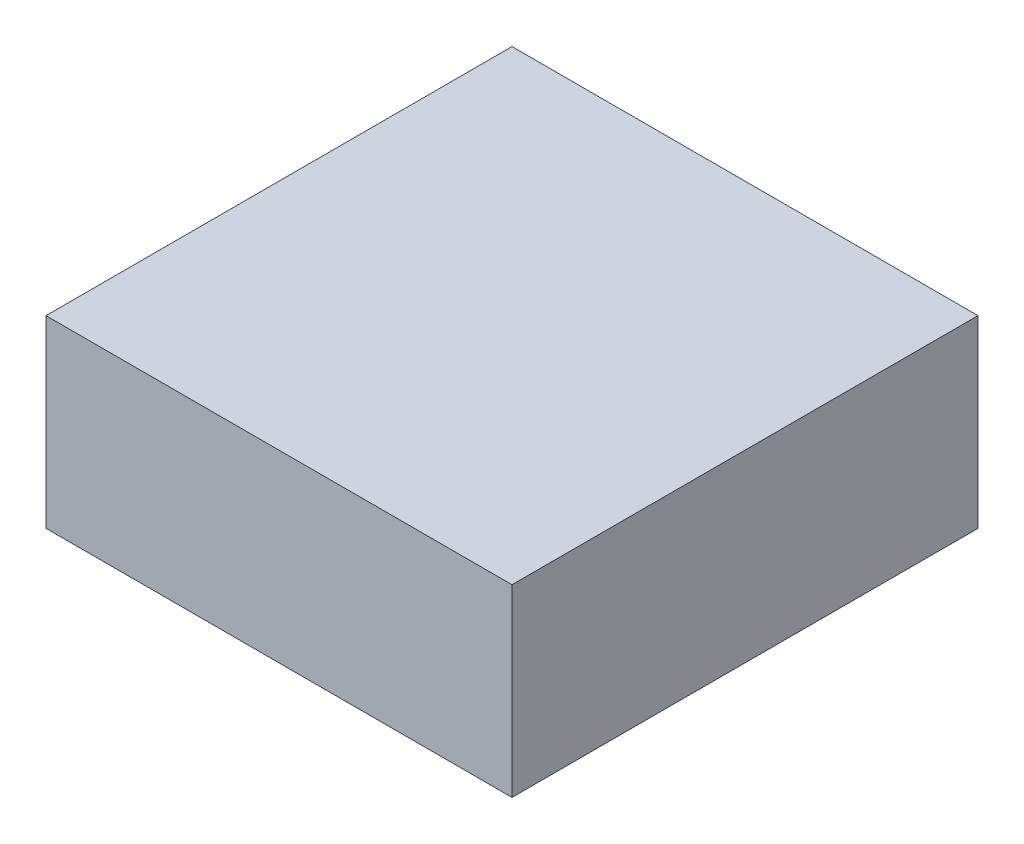
ISO-10303-21;
HEADER;
FILE_DESCRIPTION(('STEP AP214'),'2;1');
FILE_NAME('part.step','',(''),(''),'','','');
FILE_SCHEMA(('AUTOMOTIVE_DESIGN { 1 0 10303 214 1 1 1 1 }'));
ENDSEC;
DATA;
#1=APPLICATION_CONTEXT('core data for automotive mechanical design processes');
#2=APPLICATION_PROTOCOL_DEFINITION('international standard','automotive_design',2000,#1);
#3=PRODUCT_CONTEXT('',#1,'mechanical');
#4=PRODUCT('Part','Part','',(#3));
#5=PRODUCT_RELATED_PRODUCT_CATEGORY('part','',(#4));
#6=PRODUCT_DEFINITION_FORMATION('','',#4);
#7=PRODUCT_DEFINITION_CONTEXT('part definition',#1,'design');
#8=PRODUCT_DEFINITION('design','',#6,#7);
#9=PRODUCT_DEFINITION_SHAPE('','',#8);
#10=(LENGTH_UNIT() NAMED_UNIT(*) SI_UNIT(.MILLI.,.METRE.));
#11=(NAMED_UNIT(*) PLANE_ANGLE_UNIT() SI_UNIT($,.RADIAN.));
#12=(NAMED_UNIT(*) SI_UNIT($,.STERADIAN.) SOLID_ANGLE_UNIT());
#13=UNCERTAINTY_MEASURE_WITH_UNIT(LENGTH_MEASURE(1.E-05),#10,'distance_accuracy_value','');
#14=(GEOMETRIC_REPRESENTATION_CONTEXT(3) GLOBAL_UNCERTAINTY_ASSIGNED_CONTEXT((#13)) GLOBAL_UNIT_ASSIGNED_CONTEXT((#10,
#11,#12)) REPRESENTATION_CONTEXT('',''));
#15=CARTESIAN_POINT('',(0.,0.,0.));
#16=DIRECTION('',(0.,0.,1.));
#17=DIRECTION('',(1.,0.,0.));
#18=AXIS2_PLACEMENT_3D('',#15,#16,#17);
#19=CARTESIAN_POINT('',(0.,0.,0.));
#20=DIRECTION('',(0.,1.,0.));
#21=DIRECTION('',(0.,0.,1.));
#22=AXIS2_PLACEMENT_3D('',#19,#20,#21);
#23=PLANE('',#22);
#24=DIRECTION('',(0.,0.,1.));
#25=VECTOR('',#24,1.);
#26=CARTESIAN_POINT('',(29.4333501914267,0.,-37.9136664234594));
#27=LINE('',#26,#25);
#28=CARTESIAN_POINT('',(29.4333501914267,0.,-37.9136664234594));
#29=VERTEX_POINT('',#28);
#30=CARTESIAN_POINT('',(29.4333501914267,0.,-5.026060240705));
#31=VERTEX_POINT('',#30);
#32=EDGE_CURVE('E295',#29,#31,#27,.T.);
#33=ORIENTED_EDGE('',*,*,#32,.F.);
#34=DIRECTION('',(-1.,0.,0.));
#35=VECTOR('',#34,1.);
#36=CARTESIAN_POINT('',(29.4333501914267,0.,-37.9136664234594));
#37=LINE('',#36,#35);
#38=CARTESIAN_POINT('',(62.3209563741811,0.,-37.9136664234594));
#39=VERTEX_POINT('',#38);
#40=EDGE_CURVE('E95',#39,#29,#37,.T.);
#41=ORIENTED_EDGE('',*,*,#40,.F.);
#42=DIRECTION('',(0.,0.,-1.));
#43=VECTOR('',#42,1.);
#44=CARTESIAN_POINT('',(62.3209563741811,0.,-37.9136664234594));
#45=LINE('',#44,#43);
#46=CARTESIAN_POINT('',(62.3209563741811,0.,-5.026060240705));
#47=VERTEX_POINT('',#46);
#48=EDGE_CURVE('E309',#47,#39,#45,.T.);
#49=ORIENTED_EDGE('',*,*,#48,.F.);
#50=DIRECTION('',(1.,0.,0.));
#51=VECTOR('',#50,1.);
#52=CARTESIAN_POINT('',(29.4333501914267,0.,-5.026060240705));
#53=LINE('',#52,#51);
#54=EDGE_CURVE('E307',#31,#47,#53,.T.);
#55=ORIENTED_EDGE('',*,*,#54,.F.);
#56=EDGE_LOOP('',(#33,#41,#49,#55));
#57=FACE_BOUND('',#56,.T.);
#58=DIRECTION('',(0.,0.,1.));
#59=VECTOR('',#58,1.);
#60=CARTESIAN_POINT('',(31.4504743681425,0.,0.));
#61=LINE('',#60,#59);
#62=CARTESIAN_POINT('',(31.4504743681425,0.,-7.04318441742078));
#63=VERTEX_POINT('',#62);
#64=CARTESIAN_POINT('',(31.4504743681424,0.,-35.8965422467436));
#65=VERTEX_POINT('',#64);
#66=EDGE_CURVE('E12',#63,#65,#61,.F.);
#67=ORIENTED_EDGE('',*,*,#66,.F.);
#68=DIRECTION('',(1.,0.,0.));
#69=VECTOR('',#68,1.);
#70=CARTESIAN_POINT('',(0.,0.,-7.04318441742078));
#71=LINE('',#70,#69);
#72=CARTESIAN_POINT('',(60.3038321974653,0.,-7.04318441742079));
#73=VERTEX_POINT('',#72);
#74=EDGE_CURVE('E330',#73,#63,#71,.F.);
#75=ORIENTED_EDGE('',*,*,#74,.F.);
#76=DIRECTION('',(0.,0.,-1.));
#77=VECTOR('',#76,1.);
#78=CARTESIAN_POINT('',(60.3038321974653,0.,0.));
#79=LINE('',#78,#77);
#80=CARTESIAN_POINT('',(60.3038321974653,0.,-35.8965422467436));
#81=VERTEX_POINT('',#80);
#82=EDGE_CURVE('E329',#81,#73,#79,.F.);
#83=ORIENTED_EDGE('',*,*,#82,.F.);
#84=DIRECTION('',(-1.,0.,0.));
#85=VECTOR('',#84,1.);
#86=CARTESIAN_POINT('',(0.,0.,-35.8965422467436));
#87=LINE('',#86,#85);
#88=EDGE_CURVE('E54',#65,#81,#87,.F.);
#89=ORIENTED_EDGE('',*,*,#88,.F.);
#90=EDGE_LOOP('',(#67,#75,#83,#89));
#91=FACE_BOUND('',#90,.T.);
#92=ADVANCED_FACE('F46',(#57,#91),#23,.F.);
#93=CARTESIAN_POINT('',(29.4333501914267,13.,-37.9136664234594));
#94=DIRECTION('',(1.,0.,0.));
#95=DIRECTION('',(0.,0.,-1.));
#96=AXIS2_PLACEMENT_3D('',#93,#94,#95);
#97=PLANE('',#96);
#98=ORIENTED_EDGE('',*,*,#32,.T.);
#99=DIRECTION('',(0.,-1.,0.));
#100=VECTOR('',#99,1.);
#101=CARTESIAN_POINT('',(29.4333501914267,13.,-5.026060240705));
#102=LINE('',#101,#100);
#103=CARTESIAN_POINT('',(29.4333501914267,13.,-5.026060240705));
#104=VERTEX_POINT('',#103);
#105=EDGE_CURVE('E322',#104,#31,#102,.T.);
#106=ORIENTED_EDGE('',*,*,#105,.F.);
#107=DIRECTION('',(0.,0.,1.));
#108=VECTOR('',#107,1.);
#109=CARTESIAN_POINT('',(29.4333501914267,13.,-37.9136664234594));
#110=LINE('',#109,#108);
#111=CARTESIAN_POINT('',(29.4333501914267,13.,-37.9136664234594));
#112=VERTEX_POINT('',#111);
#113=EDGE_CURVE('E291',#112,#104,#110,.T.);
#114=ORIENTED_EDGE('',*,*,#113,.F.);
#115=DIRECTION('',(0.,-1.,0.));
#116=VECTOR('',#115,1.);
#117=CARTESIAN_POINT('',(29.4333501914267,13.,-37.9136664234594));
#118=LINE('',#117,#116);
#119=EDGE_CURVE('E303',#112,#29,#118,.T.);
#120=ORIENTED_EDGE('',*,*,#119,.T.);
#121=EDGE_LOOP('',(#98,#106,#114,#120));
#122=FACE_BOUND('',#121,.T.);
#123=ADVANCED_FACE('F48',(#122),#97,.F.);
#124=CARTESIAN_POINT('',(29.4333501914267,13.,-5.026060240705));
#125=DIRECTION('',(0.,0.,-1.));
#126=DIRECTION('',(-1.,0.,0.));
#127=AXIS2_PLACEMENT_3D('',#124,#125,#126);
#128=PLANE('',#127);
#129=ORIENTED_EDGE('',*,*,#54,.T.);
#130=DIRECTION('',(0.,-1.,0.));
#131=VECTOR('',#130,1.);
#132=CARTESIAN_POINT('',(62.3209563741811,13.,-5.026060240705));
#133=LINE('',#132,#131);
#134=CARTESIAN_POINT('',(62.3209563741811,13.,-5.026060240705));
#135=VERTEX_POINT('',#134);
#136=EDGE_CURVE('E319',#135,#47,#133,.T.);
#137=ORIENTED_EDGE('',*,*,#136,.F.);
#138=DIRECTION('',(1.,0.,0.));
#139=VECTOR('',#138,1.);
#140=CARTESIAN_POINT('',(29.4333501914267,13.,-5.026060240705));
#141=LINE('',#140,#139);
#142=EDGE_CURVE('E99',#104,#135,#141,.T.);
#143=ORIENTED_EDGE('',*,*,#142,.F.);
#144=ORIENTED_EDGE('',*,*,#105,.T.);
#145=EDGE_LOOP('',(#129,#137,#143,#144));
#146=FACE_BOUND('',#145,.T.);
#147=ADVANCED_FACE('F392',(#146),#128,.F.);
#148=CARTESIAN_POINT('',(62.3209563741811,13.,-37.9136664234594));
#149=DIRECTION('',(-1.,0.,0.));
#150=DIRECTION('',(0.,0.,1.));
#151=AXIS2_PLACEMENT_3D('',#148,#149,#150);
#152=PLANE('',#151);
#153=ORIENTED_EDGE('',*,*,#48,.T.);
#154=DIRECTION('',(0.,-1.,0.));
#155=VECTOR('',#154,1.);
#156=CARTESIAN_POINT('',(62.3209563741811,13.,-37.9136664234594));
#157=LINE('',#156,#155);
#158=CARTESIAN_POINT('',(62.3209563741811,13.,-37.9136664234594));
#159=VERTEX_POINT('',#158);
#160=EDGE_CURVE('E320',#159,#39,#157,.T.);
#161=ORIENTED_EDGE('',*,*,#160,.F.);
#162=DIRECTION('',(0.,0.,-1.));
#163=VECTOR('',#162,1.);
#164=CARTESIAN_POINT('',(62.3209563741811,13.,-37.9136664234594));
#165=LINE('',#164,#163);
#166=EDGE_CURVE('E297',#135,#159,#165,.T.);
#167=ORIENTED_EDGE('',*,*,#166,.F.);
#168=ORIENTED_EDGE('',*,*,#136,.T.);
#169=EDGE_LOOP('',(#153,#161,#167,#168));
#170=FACE_BOUND('',#169,.T.);
#171=ADVANCED_FACE('F401',(#170),#152,.F.);
#172=CARTESIAN_POINT('',(29.4333501914267,13.,-37.9136664234594));
#173=DIRECTION('',(0.,0.,1.));
#174=DIRECTION('',(1.,0.,0.));
#175=AXIS2_PLACEMENT_3D('',#172,#173,#174);
#176=PLANE('',#175);
#177=ORIENTED_EDGE('',*,*,#40,.T.);
#178=ORIENTED_EDGE('',*,*,#119,.F.);
#179=DIRECTION('',(-1.,0.,0.));
#180=VECTOR('',#179,1.);
#181=CARTESIAN_POINT('',(29.4333501914267,13.,-37.9136664234594));
#182=LINE('',#181,#180);
#183=EDGE_CURVE('E72',#159,#112,#182,.T.);
#184=ORIENTED_EDGE('',*,*,#183,.F.);
#185=ORIENTED_EDGE('',*,*,#160,.T.);
#186=EDGE_LOOP('',(#177,#178,#184,#185));
#187=FACE_BOUND('',#186,.T.);
#188=ADVANCED_FACE('F399',(#187),#176,.F.);
#189=CARTESIAN_POINT('',(0.,13.,0.));
#190=DIRECTION('',(0.,1.,0.));
#191=DIRECTION('',(0.,0.,1.));
#192=AXIS2_PLACEMENT_3D('',#189,#190,#191);
#193=PLANE('',#192);
#194=ORIENTED_EDGE('',*,*,#113,.T.);
#195=ORIENTED_EDGE('',*,*,#142,.T.);
#196=ORIENTED_EDGE('',*,*,#166,.T.);
#197=ORIENTED_EDGE('',*,*,#183,.T.);
#198=EDGE_LOOP('',(#194,#195,#196,#197));
#199=FACE_BOUND('',#198,.T.);
#200=ADVANCED_FACE('F398',(#199),#193,.T.);
#201=CARTESIAN_POINT('',(33.3771532828039,9.91190374790661,-8.96986333208211));
#202=DIRECTION('',(-0.981627183447664,0.190808995376545,0.));
#203=DIRECTION('',(0.190808995376545,0.981627183447664,0.));
#204=AXIS2_PLACEMENT_3D('',#201,#202,#203);
#205=PLANE('',#204);
#206=ORIENTED_EDGE('',*,*,#66,.T.);
#207=DIRECTION('',(0.187427559991896,0.964231206459823,0.187427559991903));
#208=VECTOR('',#207,1.);
#209=CARTESIAN_POINT('',(33.3771532828039,9.91190374790678,-33.9698633320821));
#210=LINE('',#209,#208);
#211=CARTESIAN_POINT('',(33.3771532828039,9.91190374790678,-33.9698633320821));
#212=VERTEX_POINT('',#211);
#213=EDGE_CURVE('E260',#65,#212,#210,.T.);
#214=ORIENTED_EDGE('',*,*,#213,.T.);
#215=DIRECTION('',(0.,0.,-1.));
#216=VECTOR('',#215,1.);
#217=CARTESIAN_POINT('',(33.3771532828039,9.91190374790661,-8.96986333208211));
#218=LINE('',#217,#216);
#219=CARTESIAN_POINT('',(33.3771532828039,9.91190374790661,-8.96986333208211));
#220=VERTEX_POINT('',#219);
#221=EDGE_CURVE('E219',#220,#212,#218,.T.);
#222=ORIENTED_EDGE('',*,*,#221,.F.);
#223=DIRECTION('',(0.187427559991896,0.964231206459826,-0.18742755999189));
#224=VECTOR('',#223,1.);
#225=CARTESIAN_POINT('',(33.3771532828039,9.91190374790661,-8.96986333208211));
#226=LINE('',#225,#224);
#227=EDGE_CURVE('E258',#63,#220,#226,.T.);
#228=ORIENTED_EDGE('',*,*,#227,.F.);
#229=EDGE_LOOP('',(#206,#214,#222,#228));
#230=FACE_BOUND('',#229,.T.);
#231=ADVANCED_FACE('F348',(#230),#205,.F.);
#232=CARTESIAN_POINT('',(33.3771532828039,9.91190374790678,-33.9698633320821));
#233=DIRECTION('',(0.,0.190808995376552,-0.981627183447663));
#234=DIRECTION('',(0.,0.981627183447663,0.190808995376552));
#235=AXIS2_PLACEMENT_3D('',#232,#233,#234);
#236=PLANE('',#235);
#237=ORIENTED_EDGE('',*,*,#88,.T.);
#238=DIRECTION('',(-0.187427559991896,0.964231206459823,0.187427559991903));
#239=VECTOR('',#238,1.);
#240=CARTESIAN_POINT('',(57.498926026691,14.429991305277,-33.0916360759692));
#241=LINE('',#240,#239);
#242=CARTESIAN_POINT('',(58.3771532828039,9.91190374790678,-33.9698633320821));
#243=VERTEX_POINT('',#242);
#244=EDGE_CURVE('E261',#81,#243,#241,.T.);
#245=ORIENTED_EDGE('',*,*,#244,.T.);
#246=DIRECTION('',(1.,0.,0.));
#247=VECTOR('',#246,1.);
#248=CARTESIAN_POINT('',(33.3771532828039,9.91190374790678,-33.9698633320821));
#249=LINE('',#248,#247);
#250=EDGE_CURVE('E243',#212,#243,#249,.T.);
#251=ORIENTED_EDGE('',*,*,#250,.F.);
#252=ORIENTED_EDGE('',*,*,#213,.F.);
#253=EDGE_LOOP('',(#237,#245,#251,#252));
#254=FACE_BOUND('',#253,.T.);
#255=ADVANCED_FACE('F340',(#254),#236,.F.);
#256=CARTESIAN_POINT('',(58.3771532828039,9.91190374790661,-8.96986333208211));
#257=DIRECTION('',(0.981627183447664,0.190808995376545,0.));
#258=DIRECTION('',(0.190808995376545,-0.981627183447664,0.));
#259=AXIS2_PLACEMENT_3D('',#256,#257,#258);
#260=PLANE('',#259);
#261=ORIENTED_EDGE('',*,*,#82,.T.);
#262=DIRECTION('',(-0.187427559991896,0.964231206459826,-0.18742755999189));
#263=VECTOR('',#262,1.);
#264=CARTESIAN_POINT('',(57.498926026691,14.4299913052768,-9.84809058819498));
#265=LINE('',#264,#263);
#266=CARTESIAN_POINT('',(58.3771532828039,9.91190374790661,-8.96986333208211));
#267=VERTEX_POINT('',#266);
#268=EDGE_CURVE('E65',#73,#267,#265,.T.);
#269=ORIENTED_EDGE('',*,*,#268,.T.);
#270=DIRECTION('',(0.,0.,1.));
#271=VECTOR('',#270,1.);
#272=CARTESIAN_POINT('',(58.3771532828039,9.91190374790661,-8.96986333208211));
#273=LINE('',#272,#271);
#274=EDGE_CURVE('E248',#243,#267,#273,.T.);
#275=ORIENTED_EDGE('',*,*,#274,.F.);
#276=ORIENTED_EDGE('',*,*,#244,.F.);
#277=EDGE_LOOP('',(#261,#269,#275,#276));
#278=FACE_BOUND('',#277,.T.);
#279=ADVANCED_FACE('F342',(#278),#260,.F.);
#280=CARTESIAN_POINT('',(33.3771532828039,9.91190374790661,-8.96986333208211));
#281=DIRECTION('',(0.,0.190808995376538,0.981627183447665));
#282=DIRECTION('',(0.,-0.981627183447665,0.190808995376538));
#283=AXIS2_PLACEMENT_3D('',#280,#281,#282);
#284=PLANE('',#283);
#285=ORIENTED_EDGE('',*,*,#74,.T.);
#286=ORIENTED_EDGE('',*,*,#227,.T.);
#287=DIRECTION('',(-1.,0.,0.));
#288=VECTOR('',#287,1.);
#289=CARTESIAN_POINT('',(33.3771532828039,9.91190374790661,-8.96986333208211));
#290=LINE('',#289,#288);
#291=EDGE_CURVE('E252',#267,#220,#290,.T.);
#292=ORIENTED_EDGE('',*,*,#291,.F.);
#293=ORIENTED_EDGE('',*,*,#268,.F.);
#294=EDGE_LOOP('',(#285,#286,#292,#293));
#295=FACE_BOUND('',#294,.T.);
#296=ADVANCED_FACE('F350',(#295),#284,.F.);
#297=CARTESIAN_POINT('',(50.6696026459968,9.91190374790669,-20.332235939506));
#298=DIRECTION('',(0.,-1.,0.));
#299=DIRECTION('',(0.,0.,-1.));
#300=AXIS2_PLACEMENT_3D('',#297,#298,#299);
#301=PLANE('',#300);
#302=ORIENTED_EDGE('',*,*,#221,.T.);
#303=ORIENTED_EDGE('',*,*,#250,.T.);
#304=ORIENTED_EDGE('',*,*,#274,.T.);
#305=ORIENTED_EDGE('',*,*,#291,.T.);
#306=EDGE_LOOP('',(#302,#303,#304,#305));
#307=FACE_BOUND('',#306,.T.);
#308=DIRECTION('',(0.,0.,-1.));
#309=VECTOR('',#308,1.);
#310=CARTESIAN_POINT('',(35.4899254484007,9.91190374790669,-20.332235939506));
#311=LINE('',#310,#309);
#312=CARTESIAN_POINT('',(35.4899254484007,9.91190374790677,-31.8570911664853));
#313=VERTEX_POINT('',#312);
#314=CARTESIAN_POINT('',(35.4899254484007,9.91190374790662,-11.0826354976789));
#315=VERTEX_POINT('',#314);
#316=EDGE_CURVE('E288',#313,#315,#311,.F.);
#317=ORIENTED_EDGE('',*,*,#316,.T.);
#318=DIRECTION('',(-1.,0.,0.));
#319=VECTOR('',#318,1.);
#320=CARTESIAN_POINT('',(50.6696026459968,9.91190374790662,-11.0826354976789));
#321=LINE('',#320,#319);
#322=CARTESIAN_POINT('',(56.2643811172071,9.91190374790662,-11.0826354976789));
#323=VERTEX_POINT('',#322);
#324=EDGE_CURVE('E276',#315,#323,#321,.F.);
#325=ORIENTED_EDGE('',*,*,#324,.T.);
#326=DIRECTION('',(0.,0.,1.));
#327=VECTOR('',#326,1.);
#328=CARTESIAN_POINT('',(56.2643811172071,9.91190374790669,-20.332235939506));
#329=LINE('',#328,#327);
#330=CARTESIAN_POINT('',(56.2643811172071,9.91190374790677,-31.8570911664853));
#331=VERTEX_POINT('',#330);
#332=EDGE_CURVE('E285',#323,#331,#329,.F.);
#333=ORIENTED_EDGE('',*,*,#332,.T.);
#334=DIRECTION('',(1.,0.,0.));
#335=VECTOR('',#334,1.);
#336=CARTESIAN_POINT('',(50.6696026459968,9.91190374790677,-31.8570911664853));
#337=LINE('',#336,#335);
#338=EDGE_CURVE('E284',#331,#313,#337,.F.);
#339=ORIENTED_EDGE('',*,*,#338,.T.);
#340=EDGE_LOOP('',(#317,#325,#333,#339));
#341=FACE_BOUND('',#340,.T.);
#342=ADVANCED_FACE('F355',(#307,#341),#301,.T.);
#343=CARTESIAN_POINT('',(33.3771532828039,19.8517152926414,-8.96986333208204));
#344=DIRECTION('',(-0.978147600733806,-0.207911690817759,0.));
#345=DIRECTION('',(-0.207911690817759,0.978147600733806,0.));
#346=AXIS2_PLACEMENT_3D('',#343,#344,#345);
#347=PLANE('',#346);
#348=ORIENTED_EDGE('',*,*,#316,.F.);
#349=DIRECTION('',(-0.203558594952779,0.957667894857974,-0.203558594952772));
#350=VECTOR('',#349,1.);
#351=CARTESIAN_POINT('',(33.8951045525433,17.4149461537831,-33.4519120623427));
#352=LINE('',#351,#350);
#353=CARTESIAN_POINT('',(36.5655017078542,4.85171529264154,-30.7815149070318));
#354=VERTEX_POINT('',#353);
#355=EDGE_CURVE('E215',#354,#313,#352,.T.);
#356=ORIENTED_EDGE('',*,*,#355,.F.);
#357=DIRECTION('',(0.,0.,1.));
#358=VECTOR('',#357,1.);
#359=CARTESIAN_POINT('',(36.5655017078542,4.85171529264139,-8.96986333208215));
#360=LINE('',#359,#358);
#361=CARTESIAN_POINT('',(36.5655017078542,4.85171529264141,-12.1582117571325));
#362=VERTEX_POINT('',#361);
#363=EDGE_CURVE('E228',#362,#354,#360,.F.);
#364=ORIENTED_EDGE('',*,*,#363,.F.);
#365=DIRECTION('',(-0.203558594952779,0.957667894857971,0.203558594952786));
#366=VECTOR('',#365,1.);
#367=CARTESIAN_POINT('',(33.3771532828039,19.8517152926414,-8.96986333208204));
#368=LINE('',#367,#366);
#369=EDGE_CURVE('E216',#362,#315,#368,.T.);
#370=ORIENTED_EDGE('',*,*,#369,.T.);
#371=EDGE_LOOP('',(#348,#356,#364,#370));
#372=FACE_BOUND('',#371,.T.);
#373=ADVANCED_FACE('F354',(#372),#347,.T.);
#374=CARTESIAN_POINT('',(45.8771532828039,19.8517152926416,-33.969863332082));
#375=DIRECTION('',(0.,-0.207911690817753,-0.978147600733807));
#376=DIRECTION('',(0.,0.978147600733807,-0.207911690817753));
#377=AXIS2_PLACEMENT_3D('',#374,#375,#376);
#378=PLANE('',#377);
#379=ORIENTED_EDGE('',*,*,#338,.F.);
#380=DIRECTION('',(0.203558594952779,0.957667894857974,-0.203558594952772));
#381=VECTOR('',#380,1.);
#382=CARTESIAN_POINT('',(57.3412507433252,14.9781770149247,-32.9339607926033));
#383=LINE('',#382,#381);
#384=CARTESIAN_POINT('',(55.1888048577536,4.85171529264154,-30.7815149070318));
#385=VERTEX_POINT('',#384);
#386=EDGE_CURVE('E220',#385,#331,#383,.T.);
#387=ORIENTED_EDGE('',*,*,#386,.F.);
#388=DIRECTION('',(-1.,0.,0.));
#389=VECTOR('',#388,1.);
#390=CARTESIAN_POINT('',(45.8771532828039,4.85171529264154,-30.7815149070318));
#391=LINE('',#390,#389);
#392=EDGE_CURVE('E235',#354,#385,#391,.F.);
#393=ORIENTED_EDGE('',*,*,#392,.F.);
#394=ORIENTED_EDGE('',*,*,#355,.T.);
#395=EDGE_LOOP('',(#379,#387,#393,#394));
#396=FACE_BOUND('',#395,.T.);
#397=ADVANCED_FACE('F372',(#396),#378,.T.);
#398=CARTESIAN_POINT('',(58.3771532828039,19.8517152926414,-8.96986333208204));
#399=DIRECTION('',(0.978147600733806,-0.207911690817759,0.));
#400=DIRECTION('',(-0.207911690817759,-0.978147600733806,0.));
#401=AXIS2_PLACEMENT_3D('',#398,#399,#400);
#402=PLANE('',#401);
#403=ORIENTED_EDGE('',*,*,#332,.F.);
#404=DIRECTION('',(0.203558594952779,0.957667894857971,0.203558594952786));
#405=VECTOR('',#404,1.);
#406=CARTESIAN_POINT('',(57.7556117591166,16.9275923260113,-9.59140485576931));
#407=LINE('',#406,#405);
#408=CARTESIAN_POINT('',(55.1888048577536,4.85171529264141,-12.1582117571325));
#409=VERTEX_POINT('',#408);
#410=EDGE_CURVE('E222',#409,#323,#407,.T.);
#411=ORIENTED_EDGE('',*,*,#410,.F.);
#412=DIRECTION('',(0.,0.,-1.));
#413=VECTOR('',#412,1.);
#414=CARTESIAN_POINT('',(55.1888048577536,4.85171529264139,-8.96986333208215));
#415=LINE('',#414,#413);
#416=EDGE_CURVE('E223',#385,#409,#415,.F.);
#417=ORIENTED_EDGE('',*,*,#416,.F.);
#418=ORIENTED_EDGE('',*,*,#386,.T.);
#419=EDGE_LOOP('',(#403,#411,#417,#418));
#420=FACE_BOUND('',#419,.T.);
#421=ADVANCED_FACE('F367',(#420),#402,.T.);
#422=CARTESIAN_POINT('',(43.3771532828039,19.8517152926414,-8.96986333208204));
#423=DIRECTION('',(0.,-0.207911690817766,0.978147600733804));
#424=DIRECTION('',(0.,-0.978147600733804,-0.207911690817766));
#425=AXIS2_PLACEMENT_3D('',#422,#423,#424);
#426=PLANE('',#425);
#427=ORIENTED_EDGE('',*,*,#324,.F.);
#428=ORIENTED_EDGE('',*,*,#369,.F.);
#429=DIRECTION('',(1.,0.,0.));
#430=VECTOR('',#429,1.);
#431=CARTESIAN_POINT('',(43.3771532828039,4.85171529264141,-12.1582117571325));
#432=LINE('',#431,#430);
#433=EDGE_CURVE('E210',#409,#362,#432,.F.);
#434=ORIENTED_EDGE('',*,*,#433,.F.);
#435=ORIENTED_EDGE('',*,*,#410,.T.);
#436=EDGE_LOOP('',(#427,#428,#434,#435));
#437=FACE_BOUND('',#436,.T.);
#438=ADVANCED_FACE('F364',(#437),#426,.T.);
#439=CARTESIAN_POINT('',(44.152492652824,4.85171529264142,-14.1582117571325));
#440=DIRECTION('',(0.,0.207911690817753,0.978147600733807));
#441=DIRECTION('',(0.,-0.978147600733807,0.207911690817753));
#442=AXIS2_PLACEMENT_3D('',#439,#440,#441);
#443=PLANE('',#442);
#444=DIRECTION('',(-1.,0.,0.));
#445=VECTOR('',#444,1.);
#446=CARTESIAN_POINT('',(50.6696026459968,9.91190374790665,-15.233788016586));
#447=LINE('',#446,#445);
#448=CARTESIAN_POINT('',(52.1132285983,9.91190374790665,-15.233788016586));
#449=VERTEX_POINT('',#448);
#450=CARTESIAN_POINT('',(39.6410779673077,9.91190374790665,-15.233788016586));
#451=VERTEX_POINT('',#450);
#452=EDGE_CURVE('E274',#449,#451,#447,.T.);
#453=ORIENTED_EDGE('',*,*,#452,.F.);
#454=DIRECTION('',(0.203558594952779,-0.957667894857974,0.203558594952773));
#455=VECTOR('',#454,1.);
#456=CARTESIAN_POINT('',(53.1888048577536,4.85171529264142,-14.1582117571325));
#457=LINE('',#456,#455);
#458=CARTESIAN_POINT('',(53.1888048577536,4.85171529264142,-14.1582117571325));
#459=VERTEX_POINT('',#458);
#460=EDGE_CURVE('E204',#449,#459,#457,.T.);
#461=ORIENTED_EDGE('',*,*,#460,.T.);
#462=DIRECTION('',(-1.,0.,0.));
#463=VECTOR('',#462,1.);
#464=CARTESIAN_POINT('',(44.152492652824,4.85171529264142,-14.1582117571325));
#465=LINE('',#464,#463);
#466=CARTESIAN_POINT('',(38.5655017078542,4.85171529264142,-14.1582117571325));
#467=VERTEX_POINT('',#466);
#468=EDGE_CURVE('E200',#459,#467,#465,.T.);
#469=ORIENTED_EDGE('',*,*,#468,.T.);
#470=DIRECTION('',(-0.203558594952779,-0.957667894857974,0.203558594952773));
#471=VECTOR('',#470,1.);
#472=CARTESIAN_POINT('',(38.7970048321718,5.94085186174414,-14.38971488145));
#473=LINE('',#472,#471);
#474=EDGE_CURVE('E185',#451,#467,#473,.T.);
#475=ORIENTED_EDGE('',*,*,#474,.F.);
#476=EDGE_LOOP('',(#453,#461,#469,#475));
#477=FACE_BOUND('',#476,.T.);
#478=ADVANCED_FACE('F466',(#477),#443,.F.);
#479=CARTESIAN_POINT('',(53.1888048577536,4.85171529264142,-14.1582117571325));
#480=DIRECTION('',(0.978147600733806,0.20791169081776,0.));
#481=DIRECTION('',(0.20791169081776,-0.978147600733806,0.));
#482=AXIS2_PLACEMENT_3D('',#479,#480,#481);
#483=PLANE('',#482);
#484=DIRECTION('',(0.,0.,1.));
#485=VECTOR('',#484,1.);
#486=CARTESIAN_POINT('',(52.1132285983,9.91190374790669,-20.332235939506));
#487=LINE('',#486,#485);
#488=CARTESIAN_POINT('',(52.1132285983,9.91190374790674,-27.7059386475783));
#489=VERTEX_POINT('',#488);
#490=EDGE_CURVE('E275',#489,#449,#487,.T.);
#491=ORIENTED_EDGE('',*,*,#490,.F.);
#492=DIRECTION('',(0.203558594952779,-0.957667894857971,-0.203558594952786));
#493=VECTOR('',#492,1.);
#494=CARTESIAN_POINT('',(52.8143753073292,6.61326782944649,-28.4070853566074));
#495=LINE('',#494,#493);
#496=CARTESIAN_POINT('',(53.1888048577536,4.85171529264152,-28.7815149070318));
#497=VERTEX_POINT('',#496);
#498=EDGE_CURVE('E182',#489,#497,#495,.T.);
#499=ORIENTED_EDGE('',*,*,#498,.T.);
#500=DIRECTION('',(0.,0.,1.));
#501=VECTOR('',#500,1.);
#502=CARTESIAN_POINT('',(53.1888048577536,4.85171529264142,-14.1582117571325));
#503=LINE('',#502,#501);
#504=EDGE_CURVE('E194',#497,#459,#503,.T.);
#505=ORIENTED_EDGE('',*,*,#504,.T.);
#506=ORIENTED_EDGE('',*,*,#460,.F.);
#507=EDGE_LOOP('',(#491,#499,#505,#506));
#508=FACE_BOUND('',#507,.T.);
#509=ADVANCED_FACE('F475',(#508),#483,.F.);
#510=CARTESIAN_POINT('',(44.152492652824,4.85171529264152,-28.7815149070318));
#511=DIRECTION('',(0.,0.207911690817767,-0.978147600733804));
#512=DIRECTION('',(0.,0.978147600733804,0.207911690817767));
#513=AXIS2_PLACEMENT_3D('',#510,#511,#512);
#514=PLANE('',#513);
#515=DIRECTION('',(1.,0.,0.));
#516=VECTOR('',#515,1.);
#517=CARTESIAN_POINT('',(50.6696026459968,9.91190374790674,-27.7059386475783));
#518=LINE('',#517,#516);
#519=CARTESIAN_POINT('',(39.6410779673077,9.91190374790674,-27.7059386475783));
#520=VERTEX_POINT('',#519);
#521=EDGE_CURVE('E180',#520,#489,#518,.T.);
#522=ORIENTED_EDGE('',*,*,#521,.F.);
#523=DIRECTION('',(-0.203558594952779,-0.957667894857971,-0.203558594952786));
#524=VECTOR('',#523,1.);
#525=CARTESIAN_POINT('',(39.1714343825961,7.70240439854921,-28.1755822322899));
#526=LINE('',#525,#524);
#527=CARTESIAN_POINT('',(38.5655017078542,4.85171529264152,-28.7815149070318));
#528=VERTEX_POINT('',#527);
#529=EDGE_CURVE('E168',#520,#528,#526,.T.);
#530=ORIENTED_EDGE('',*,*,#529,.T.);
#531=DIRECTION('',(1.,0.,0.));
#532=VECTOR('',#531,1.);
#533=CARTESIAN_POINT('',(44.152492652824,4.85171529264152,-28.7815149070318));
#534=LINE('',#533,#532);
#535=EDGE_CURVE('E174',#528,#497,#534,.T.);
#536=ORIENTED_EDGE('',*,*,#535,.T.);
#537=ORIENTED_EDGE('',*,*,#498,.F.);
#538=EDGE_LOOP('',(#522,#530,#536,#537));
#539=FACE_BOUND('',#538,.T.);
#540=ADVANCED_FACE('F175',(#539),#514,.F.);
#541=CARTESIAN_POINT('',(38.5655017078542,4.85171529264142,-14.1582117571325));
#542=DIRECTION('',(-0.978147600733806,0.20791169081776,0.));
#543=DIRECTION('',(0.20791169081776,0.978147600733806,0.));
#544=AXIS2_PLACEMENT_3D('',#541,#542,#543);
#545=PLANE('',#544);
#546=DIRECTION('',(0.,0.,-1.));
#547=VECTOR('',#546,1.);
#548=CARTESIAN_POINT('',(39.6410779673077,9.91190374790669,-20.332235939506));
#549=LINE('',#548,#547);
#550=EDGE_CURVE('E257',#451,#520,#549,.T.);
#551=ORIENTED_EDGE('',*,*,#550,.F.);
#552=ORIENTED_EDGE('',*,*,#474,.T.);
#553=DIRECTION('',(0.,0.,-1.));
#554=VECTOR('',#553,1.);
#555=CARTESIAN_POINT('',(38.5655017078542,4.85171529264142,-14.1582117571325));
#556=LINE('',#555,#554);
#557=EDGE_CURVE('E183',#467,#528,#556,.T.);
#558=ORIENTED_EDGE('',*,*,#557,.T.);
#559=ORIENTED_EDGE('',*,*,#529,.F.);
#560=EDGE_LOOP('',(#551,#552,#558,#559));
#561=FACE_BOUND('',#560,.T.);
#562=ADVANCED_FACE('F186',(#561),#545,.F.);
#563=CARTESIAN_POINT('',(45.8771532828039,4.85171529264148,-22.9698633320821));
#564=DIRECTION('',(0.,-1.,0.));
#565=DIRECTION('',(0.,0.,-1.));
#566=AXIS2_PLACEMENT_3D('',#563,#564,#565);
#567=PLANE('',#566);
#568=ORIENTED_EDGE('',*,*,#468,.F.);
#569=ORIENTED_EDGE('',*,*,#504,.F.);
#570=ORIENTED_EDGE('',*,*,#535,.F.);
#571=ORIENTED_EDGE('',*,*,#557,.F.);
#572=EDGE_LOOP('',(#568,#569,#570,#571));
#573=FACE_BOUND('',#572,.T.);
#574=ORIENTED_EDGE('',*,*,#433,.T.);
#575=ORIENTED_EDGE('',*,*,#363,.T.);
#576=ORIENTED_EDGE('',*,*,#392,.T.);
#577=ORIENTED_EDGE('',*,*,#416,.T.);
#578=EDGE_LOOP('',(#574,#575,#576,#577));
#579=FACE_BOUND('',#578,.T.);
#580=ADVANCED_FACE('F195',(#573,#579),#567,.T.);
#581=ORIENTED_EDGE('',*,*,#452,.T.);
#582=ORIENTED_EDGE('',*,*,#550,.T.);
#583=ORIENTED_EDGE('',*,*,#521,.T.);
#584=ORIENTED_EDGE('',*,*,#490,.T.);
#585=EDGE_LOOP('',(#581,#582,#583,#584));
#586=FACE_BOUND('',#585,.T.);
#587=ADVANCED_FACE('F360',(#586),#301,.T.);
#588=CLOSED_SHELL('',(#92,#123,#147,#171,#188,#200,#231,#255,#279,#296,#342,#373,#397,#421,#438,
#478,#509,#540,#562,#580,#587));
#589=MANIFOLD_SOLID_BREP('B2',#588);
#590=ADVANCED_BREP_SHAPE_REPRESENTATION('',(#18,#589),#14);
#591=SHAPE_DEFINITION_REPRESENTATION(#9,#590);
ENDSEC;
END-ISO-10303-21;
